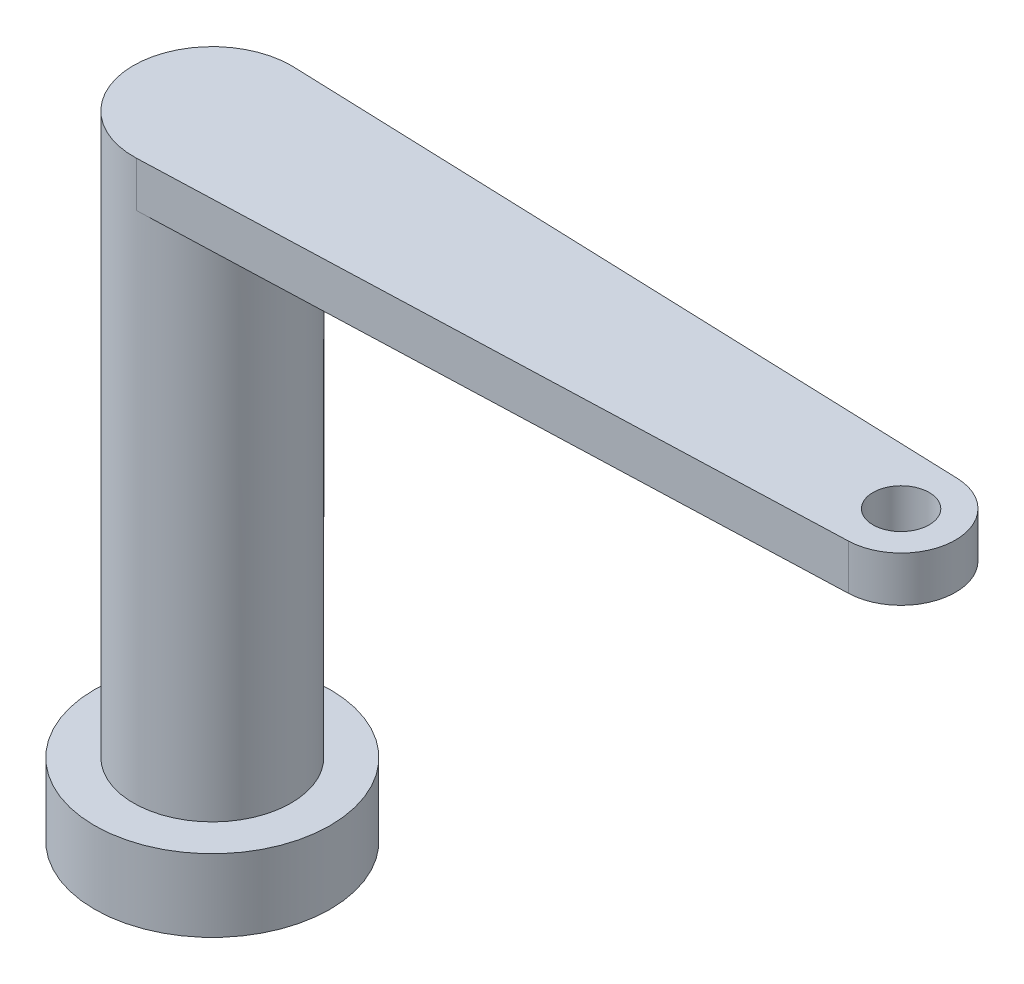
ISO-10303-21;
HEADER;
FILE_DESCRIPTION(('STEP AP214'),'2;1');
FILE_NAME('part.step','',(''),(''),'','','');
FILE_SCHEMA(('AUTOMOTIVE_DESIGN { 1 0 10303 214 1 1 1 1 }'));
ENDSEC;
DATA;
#1=APPLICATION_CONTEXT('core data for automotive mechanical design processes');
#2=APPLICATION_PROTOCOL_DEFINITION('international standard','automotive_design',2000,#1);
#3=PRODUCT_CONTEXT('',#1,'mechanical');
#4=PRODUCT('Part','Part','',(#3));
#5=PRODUCT_RELATED_PRODUCT_CATEGORY('part','',(#4));
#6=PRODUCT_DEFINITION_FORMATION('','',#4);
#7=PRODUCT_DEFINITION_CONTEXT('part definition',#1,'design');
#8=PRODUCT_DEFINITION('design','',#6,#7);
#9=PRODUCT_DEFINITION_SHAPE('','',#8);
#10=(LENGTH_UNIT() NAMED_UNIT(*) SI_UNIT(.MILLI.,.METRE.));
#11=(NAMED_UNIT(*) PLANE_ANGLE_UNIT() SI_UNIT($,.RADIAN.));
#12=(NAMED_UNIT(*) SI_UNIT($,.STERADIAN.) SOLID_ANGLE_UNIT());
#13=UNCERTAINTY_MEASURE_WITH_UNIT(LENGTH_MEASURE(1.E-05),#10,'distance_accuracy_value','');
#14=(GEOMETRIC_REPRESENTATION_CONTEXT(3) GLOBAL_UNCERTAINTY_ASSIGNED_CONTEXT((#13)) GLOBAL_UNIT_ASSIGNED_CONTEXT((#10,
#11,#12)) REPRESENTATION_CONTEXT('',''));
#15=CARTESIAN_POINT('',(0.,0.,0.));
#16=DIRECTION('',(0.,0.,1.));
#17=DIRECTION('',(1.,0.,0.));
#18=AXIS2_PLACEMENT_3D('',#15,#16,#17);
#19=CARTESIAN_POINT('',(0.,0.,0.));
#20=DIRECTION('',(0.,-1.,0.));
#21=DIRECTION('',(0.,0.,-1.));
#22=AXIS2_PLACEMENT_3D('',#19,#20,#21);
#23=CYLINDRICAL_SURFACE('',#22,4.35);
#24=CARTESIAN_POINT('',(0.,-25.,0.));
#25=DIRECTION('',(0.,-1.,0.));
#26=DIRECTION('',(0.,0.,-1.));
#27=AXIS2_PLACEMENT_3D('',#24,#25,#26);
#28=CIRCLE('',#27,4.35);
#29=CARTESIAN_POINT('',(0.,-25.,-4.35));
#30=VERTEX_POINT('',#29);
#31=EDGE_CURVE('E43',#30,#30,#28,.T.);
#32=ORIENTED_EDGE('',*,*,#31,.F.);
#33=EDGE_LOOP('',(#32));
#34=FACE_BOUND('',#33,.T.);
#35=CARTESIAN_POINT('',(0.,3.39150739398519,0.));
#36=DIRECTION('',(0.,-1.,0.));
#37=DIRECTION('',(0.,0.,-1.));
#38=AXIS2_PLACEMENT_3D('',#35,#36,#37);
#39=CIRCLE('',#38,4.35);
#40=CARTESIAN_POINT('',(0.154539473684211,3.39150739398519,-4.34725402421729));
#41=VERTEX_POINT('',#40);
#42=CARTESIAN_POINT('',(0.154539473684211,3.39150739398519,4.34725402421729));
#43=VERTEX_POINT('',#42);
#44=EDGE_CURVE('E12',#41,#43,#39,.T.);
#45=ORIENTED_EDGE('',*,*,#44,.T.);
#46=DIRECTION('',(0.,1.,0.));
#47=VECTOR('',#46,1.);
#48=CARTESIAN_POINT('',(0.154539473684211,3.39150739398519,4.34725402421729));
#49=LINE('',#48,#47);
#50=CARTESIAN_POINT('',(0.154539473684211,5.8915073939852,4.34725402421729));
#51=VERTEX_POINT('',#50);
#52=EDGE_CURVE('E88',#43,#51,#49,.T.);
#53=ORIENTED_EDGE('',*,*,#52,.T.);
#54=CARTESIAN_POINT('',(0.,5.8915073939852,0.));
#55=DIRECTION('',(0.,1.,0.));
#56=DIRECTION('',(0.,0.,1.));
#57=AXIS2_PLACEMENT_3D('',#54,#55,#56);
#58=CIRCLE('',#57,4.35);
#59=CARTESIAN_POINT('',(0.154539473684211,5.8915073939852,-4.34725402421729));
#60=VERTEX_POINT('',#59);
#61=EDGE_CURVE('E109',#60,#51,#58,.T.);
#62=ORIENTED_EDGE('',*,*,#61,.F.);
#63=DIRECTION('',(0.,1.,0.));
#64=VECTOR('',#63,1.);
#65=CARTESIAN_POINT('',(0.154539473684211,3.39150739398519,-4.34725402421729));
#66=LINE('',#65,#64);
#67=EDGE_CURVE('E73',#41,#60,#66,.T.);
#68=ORIENTED_EDGE('',*,*,#67,.F.);
#69=EDGE_LOOP('',(#45,#53,#62,#68));
#70=FACE_BOUND('',#69,.T.);
#71=ADVANCED_FACE('F35',(#34,#70),#23,.T.);
#72=CARTESIAN_POINT('',(24.,5.8915073939852,0.));
#73=DIRECTION('',(0.,1.,0.));
#74=DIRECTION('',(0.,0.,1.));
#75=AXIS2_PLACEMENT_3D('',#72,#73,#74);
#76=PLANE('',#75);
#77=DIRECTION('',(-0.999368741199376,0.,-0.0355263157894737));
#78=VECTOR('',#77,1.);
#79=CARTESIAN_POINT('',(0.154539473684211,5.8915073939852,-4.34725402421729));
#80=LINE('',#79,#78);
#81=CARTESIAN_POINT('',(38.1065789473684,5.8915073939852,-2.99810622359813));
#82=VERTEX_POINT('',#81);
#83=EDGE_CURVE('E96',#82,#60,#80,.T.);
#84=ORIENTED_EDGE('',*,*,#83,.T.);
#85=ORIENTED_EDGE('',*,*,#61,.T.);
#86=DIRECTION('',(0.999368741199376,0.,-0.0355263157894737));
#87=VECTOR('',#86,1.);
#88=CARTESIAN_POINT('',(0.154539473684211,5.8915073939852,4.34725402421729));
#89=LINE('',#88,#87);
#90=CARTESIAN_POINT('',(38.1065789473684,5.8915073939852,2.99810622359813));
#91=VERTEX_POINT('',#90);
#92=EDGE_CURVE('E104',#51,#91,#89,.T.);
#93=ORIENTED_EDGE('',*,*,#92,.T.);
#94=CARTESIAN_POINT('',(38.,5.8915073939852,0.));
#95=DIRECTION('',(0.,1.,0.));
#96=DIRECTION('',(0.,0.,1.));
#97=AXIS2_PLACEMENT_3D('',#94,#95,#96);
#98=CIRCLE('',#97,3.);
#99=EDGE_CURVE('E84',#91,#82,#98,.T.);
#100=ORIENTED_EDGE('',*,*,#99,.T.);
#101=EDGE_LOOP('',(#84,#85,#93,#100));
#102=FACE_BOUND('',#101,.T.);
#103=CARTESIAN_POINT('',(38.,5.8915073939852,0.));
#104=DIRECTION('',(0.,1.,0.));
#105=DIRECTION('',(0.,0.,1.));
#106=AXIS2_PLACEMENT_3D('',#103,#104,#105);
#107=CIRCLE('',#106,1.55);
#108=CARTESIAN_POINT('',(38.,5.8915073939852,1.55));
#109=VERTEX_POINT('',#108);
#110=EDGE_CURVE('E100',#109,#109,#107,.T.);
#111=ORIENTED_EDGE('',*,*,#110,.F.);
#112=EDGE_LOOP('',(#111));
#113=FACE_BOUND('',#112,.T.);
#114=ADVANCED_FACE('F126',(#102,#113),#76,.T.);
#115=CARTESIAN_POINT('',(4.35,3.39150739398519,0.));
#116=DIRECTION('',(0.,-1.,0.));
#117=DIRECTION('',(0.,0.,-1.));
#118=AXIS2_PLACEMENT_3D('',#115,#116,#117);
#119=PLANE('',#118);
#120=ORIENTED_EDGE('',*,*,#44,.F.);
#121=DIRECTION('',(-0.999368741199376,0.,-0.0355263157894737));
#122=VECTOR('',#121,1.);
#123=CARTESIAN_POINT('',(0.154539473684211,3.39150739398519,-4.34725402421729));
#124=LINE('',#123,#122);
#125=CARTESIAN_POINT('',(38.1065789473684,3.39150739398519,-2.99810622359813));
#126=VERTEX_POINT('',#125);
#127=EDGE_CURVE('E93',#126,#41,#124,.T.);
#128=ORIENTED_EDGE('',*,*,#127,.F.);
#129=CARTESIAN_POINT('',(38.,3.39150739398519,0.));
#130=DIRECTION('',(0.,1.,0.));
#131=DIRECTION('',(0.,0.,1.));
#132=AXIS2_PLACEMENT_3D('',#129,#130,#131);
#133=CIRCLE('',#132,3.);
#134=CARTESIAN_POINT('',(38.1065789473684,3.39150739398519,2.99810622359813));
#135=VERTEX_POINT('',#134);
#136=EDGE_CURVE('E83',#135,#126,#133,.T.);
#137=ORIENTED_EDGE('',*,*,#136,.F.);
#138=DIRECTION('',(0.999368741199376,0.,-0.0355263157894737));
#139=VECTOR('',#138,1.);
#140=CARTESIAN_POINT('',(0.154539473684211,3.39150739398519,4.34725402421729));
#141=LINE('',#140,#139);
#142=EDGE_CURVE('E92',#43,#135,#141,.T.);
#143=ORIENTED_EDGE('',*,*,#142,.F.);
#144=EDGE_LOOP('',(#120,#128,#137,#143));
#145=FACE_BOUND('',#144,.T.);
#146=CARTESIAN_POINT('',(38.,3.39150739398519,0.));
#147=DIRECTION('',(0.,1.,0.));
#148=DIRECTION('',(0.,0.,1.));
#149=AXIS2_PLACEMENT_3D('',#146,#147,#148);
#150=CIRCLE('',#149,1.55);
#151=CARTESIAN_POINT('',(38.,3.39150739398519,1.55));
#152=VERTEX_POINT('',#151);
#153=EDGE_CURVE('E106',#152,#152,#150,.T.);
#154=ORIENTED_EDGE('',*,*,#153,.T.);
#155=EDGE_LOOP('',(#154));
#156=FACE_BOUND('',#155,.T.);
#157=ADVANCED_FACE('F90',(#145,#156),#119,.T.);
#158=CARTESIAN_POINT('',(0.,-29.,0.));
#159=DIRECTION('',(0.,1.,0.));
#160=DIRECTION('',(0.,0.,1.));
#161=AXIS2_PLACEMENT_3D('',#158,#159,#160);
#162=CYLINDRICAL_SURFACE('',#161,6.5);
#163=CARTESIAN_POINT('',(0.,-29.,0.));
#164=DIRECTION('',(0.,-1.,0.));
#165=DIRECTION('',(0.,0.,-1.));
#166=AXIS2_PLACEMENT_3D('',#163,#164,#165);
#167=CIRCLE('',#166,6.5);
#168=CARTESIAN_POINT('',(0.,-29.,-6.5));
#169=VERTEX_POINT('',#168);
#170=EDGE_CURVE('E115',#169,#169,#167,.T.);
#171=ORIENTED_EDGE('',*,*,#170,.F.);
#172=EDGE_LOOP('',(#171));
#173=FACE_BOUND('',#172,.T.);
#174=CARTESIAN_POINT('',(0.,-25.,0.));
#175=DIRECTION('',(0.,-1.,0.));
#176=DIRECTION('',(0.,0.,-1.));
#177=AXIS2_PLACEMENT_3D('',#174,#175,#176);
#178=CIRCLE('',#177,6.5);
#179=CARTESIAN_POINT('',(0.,-25.,-6.5));
#180=VERTEX_POINT('',#179);
#181=EDGE_CURVE('E114',#180,#180,#178,.T.);
#182=ORIENTED_EDGE('',*,*,#181,.T.);
#183=EDGE_LOOP('',(#182));
#184=FACE_BOUND('',#183,.T.);
#185=ADVANCED_FACE('F134',(#173,#184),#162,.T.);
#186=CARTESIAN_POINT('',(0.,-29.,0.));
#187=DIRECTION('',(0.,-1.,0.));
#188=DIRECTION('',(0.,0.,-1.));
#189=AXIS2_PLACEMENT_3D('',#186,#187,#188);
#190=PLANE('',#189);
#191=ORIENTED_EDGE('',*,*,#170,.T.);
#192=EDGE_LOOP('',(#191));
#193=FACE_BOUND('',#192,.T.);
#194=ADVANCED_FACE('F140',(#193),#190,.T.);
#195=CARTESIAN_POINT('',(0.,-25.,0.));
#196=DIRECTION('',(0.,-1.,0.));
#197=DIRECTION('',(0.,0.,-1.));
#198=AXIS2_PLACEMENT_3D('',#195,#196,#197);
#199=PLANE('',#198);
#200=ORIENTED_EDGE('',*,*,#31,.T.);
#201=EDGE_LOOP('',(#200));
#202=FACE_BOUND('',#201,.T.);
#203=ORIENTED_EDGE('',*,*,#181,.F.);
#204=EDGE_LOOP('',(#203));
#205=FACE_BOUND('',#204,.T.);
#206=ADVANCED_FACE('F122',(#202,#205),#199,.F.);
#207=CARTESIAN_POINT('',(38.,3.39150739398519,0.));
#208=DIRECTION('',(0.,1.,0.));
#209=DIRECTION('',(0.,0.,1.));
#210=AXIS2_PLACEMENT_3D('',#207,#208,#209);
#211=CYLINDRICAL_SURFACE('',#210,1.55);
#212=ORIENTED_EDGE('',*,*,#153,.F.);
#213=EDGE_LOOP('',(#212));
#214=FACE_BOUND('',#213,.T.);
#215=ORIENTED_EDGE('',*,*,#110,.T.);
#216=EDGE_LOOP('',(#215));
#217=FACE_BOUND('',#216,.T.);
#218=ADVANCED_FACE('F144',(#214,#217),#211,.F.);
#219=CARTESIAN_POINT('',(0.154539473684211,3.39150739398519,4.34725402421729));
#220=DIRECTION('',(0.0355263157894737,0.,0.999368741199377));
#221=DIRECTION('',(0.999368741199377,0.,-0.0355263157894737));
#222=AXIS2_PLACEMENT_3D('',#219,#220,#221);
#223=PLANE('',#222);
#224=ORIENTED_EDGE('',*,*,#92,.F.);
#225=ORIENTED_EDGE('',*,*,#52,.F.);
#226=ORIENTED_EDGE('',*,*,#142,.T.);
#227=DIRECTION('',(0.,1.,0.));
#228=VECTOR('',#227,1.);
#229=CARTESIAN_POINT('',(38.1065789473684,3.39150739398519,2.99810622359813));
#230=LINE('',#229,#228);
#231=EDGE_CURVE('E80',#135,#91,#230,.T.);
#232=ORIENTED_EDGE('',*,*,#231,.T.);
#233=EDGE_LOOP('',(#224,#225,#226,#232));
#234=FACE_BOUND('',#233,.T.);
#235=ADVANCED_FACE('F95',(#234),#223,.T.);
#236=CARTESIAN_POINT('',(38.,3.39150739398519,0.));
#237=DIRECTION('',(0.,1.,0.));
#238=DIRECTION('',(0.,0.,1.));
#239=AXIS2_PLACEMENT_3D('',#236,#237,#238);
#240=CYLINDRICAL_SURFACE('',#239,3.);
#241=ORIENTED_EDGE('',*,*,#99,.F.);
#242=ORIENTED_EDGE('',*,*,#231,.F.);
#243=ORIENTED_EDGE('',*,*,#136,.T.);
#244=DIRECTION('',(0.,1.,0.));
#245=VECTOR('',#244,1.);
#246=CARTESIAN_POINT('',(38.1065789473684,3.39150739398519,-2.99810622359813));
#247=LINE('',#246,#245);
#248=EDGE_CURVE('E66',#126,#82,#247,.T.);
#249=ORIENTED_EDGE('',*,*,#248,.T.);
#250=EDGE_LOOP('',(#241,#242,#243,#249));
#251=FACE_BOUND('',#250,.T.);
#252=ADVANCED_FACE('F82',(#251),#240,.T.);
#253=CARTESIAN_POINT('',(0.154539473684211,3.39150739398519,-4.34725402421729));
#254=DIRECTION('',(0.0355263157894737,0.,-0.999368741199377));
#255=DIRECTION('',(-0.999368741199377,0.,-0.0355263157894737));
#256=AXIS2_PLACEMENT_3D('',#253,#254,#255);
#257=PLANE('',#256);
#258=ORIENTED_EDGE('',*,*,#83,.F.);
#259=ORIENTED_EDGE('',*,*,#248,.F.);
#260=ORIENTED_EDGE('',*,*,#127,.T.);
#261=ORIENTED_EDGE('',*,*,#67,.T.);
#262=EDGE_LOOP('',(#258,#259,#260,#261));
#263=FACE_BOUND('',#262,.T.);
#264=ADVANCED_FACE('F152',(#263),#257,.T.);
#265=CLOSED_SHELL('',(#71,#114,#157,#185,#194,#206,#218,#235,#252,#264));
#266=MANIFOLD_SOLID_BREP('B2',#265);
#267=ADVANCED_BREP_SHAPE_REPRESENTATION('',(#18,#266),#14);
#268=SHAPE_DEFINITION_REPRESENTATION(#9,#267);
ENDSEC;
END-ISO-10303-21;
